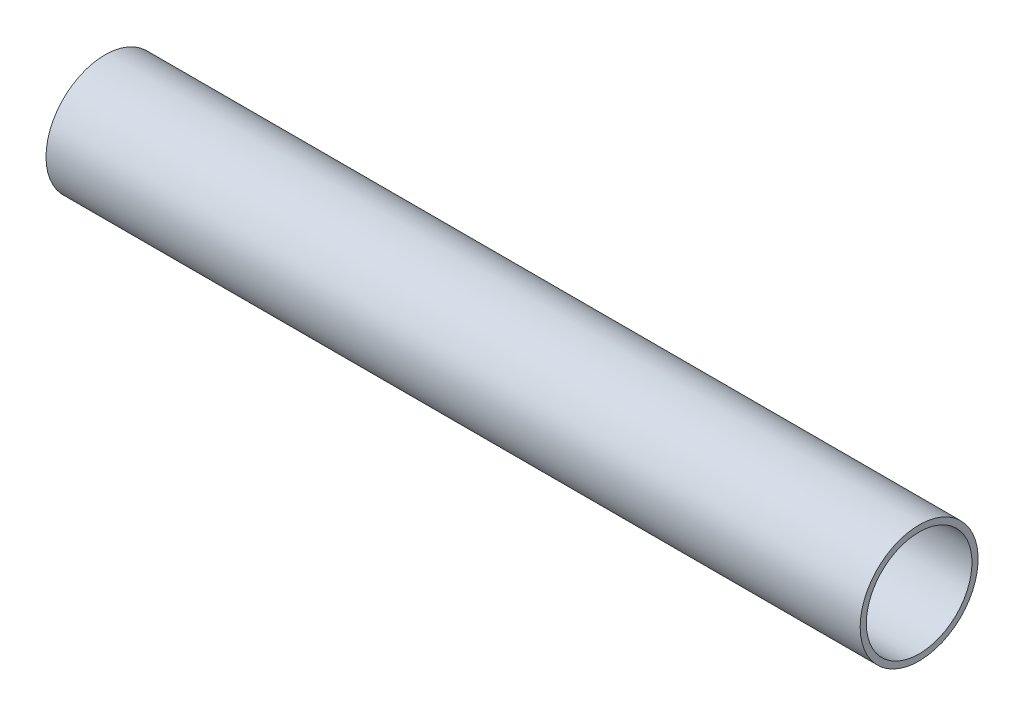
ISO-10303-21;
HEADER;
FILE_DESCRIPTION(('STEP AP214'),'2;1');
FILE_NAME('part.step','',(''),(''),'','','');
FILE_SCHEMA(('AUTOMOTIVE_DESIGN { 1 0 10303 214 1 1 1 1 }'));
ENDSEC;
DATA;
#1=APPLICATION_CONTEXT('core data for automotive mechanical design processes');
#2=APPLICATION_PROTOCOL_DEFINITION('international standard','automotive_design',2000,#1);
#3=PRODUCT_CONTEXT('',#1,'mechanical');
#4=PRODUCT('Part','Part','',(#3));
#5=PRODUCT_RELATED_PRODUCT_CATEGORY('part','',(#4));
#6=PRODUCT_DEFINITION_FORMATION('','',#4);
#7=PRODUCT_DEFINITION_CONTEXT('part definition',#1,'design');
#8=PRODUCT_DEFINITION('design','',#6,#7);
#9=PRODUCT_DEFINITION_SHAPE('','',#8);
#10=(LENGTH_UNIT() NAMED_UNIT(*) SI_UNIT(.MILLI.,.METRE.));
#11=(NAMED_UNIT(*) PLANE_ANGLE_UNIT() SI_UNIT($,.RADIAN.));
#12=(NAMED_UNIT(*) SI_UNIT($,.STERADIAN.) SOLID_ANGLE_UNIT());
#13=UNCERTAINTY_MEASURE_WITH_UNIT(LENGTH_MEASURE(1.E-05),#10,'distance_accuracy_value','');
#14=(GEOMETRIC_REPRESENTATION_CONTEXT(3) GLOBAL_UNCERTAINTY_ASSIGNED_CONTEXT((#13)) GLOBAL_UNIT_ASSIGNED_CONTEXT((#10,
#11,#12)) REPRESENTATION_CONTEXT('',''));
#15=CARTESIAN_POINT('',(0.,0.,0.));
#16=DIRECTION('',(0.,0.,1.));
#17=DIRECTION('',(1.,0.,0.));
#18=AXIS2_PLACEMENT_3D('',#15,#16,#17);
#19=CARTESIAN_POINT('',(1240.,0.,0.));
#20=DIRECTION('',(1.,0.,0.));
#21=DIRECTION('',(0.,0.,-1.));
#22=AXIS2_PLACEMENT_3D('',#19,#20,#21);
#23=PLANE('',#22);
#24=CARTESIAN_POINT('',(1240.,0.,0.));
#25=DIRECTION('',(-1.,0.,0.));
#26=DIRECTION('',(0.,0.,1.));
#27=AXIS2_PLACEMENT_3D('',#24,#25,#26);
#28=CIRCLE('',#27,13.4);
#29=CARTESIAN_POINT('',(1240.,0.,13.4));
#30=VERTEX_POINT('',#29);
#31=EDGE_CURVE('E10',#30,#30,#28,.T.);
#32=ORIENTED_EDGE('',*,*,#31,.T.);
#33=EDGE_LOOP('',(#32));
#34=FACE_BOUND('',#33,.T.);
#35=ADVANCED_FACE('F39',(#34),#23,.F.);
#36=CARTESIAN_POINT('',(-3000.,0.,0.));
#37=DIRECTION('',(-1.,0.,0.));
#38=DIRECTION('',(0.,0.,1.));
#39=AXIS2_PLACEMENT_3D('',#36,#37,#38);
#40=CYLINDRICAL_SURFACE('',#39,13.4);
#41=ORIENTED_EDGE('',*,*,#31,.F.);
#42=EDGE_LOOP('',(#41));
#43=FACE_BOUND('',#42,.T.);
#44=CARTESIAN_POINT('',(1425.,0.,0.));
#45=DIRECTION('',(-1.,0.,0.));
#46=DIRECTION('',(0.,0.,1.));
#47=AXIS2_PLACEMENT_3D('',#44,#45,#46);
#48=CIRCLE('',#47,13.4);
#49=CARTESIAN_POINT('',(1425.,0.,13.4));
#50=VERTEX_POINT('',#49);
#51=EDGE_CURVE('E44',#50,#50,#48,.T.);
#52=ORIENTED_EDGE('',*,*,#51,.T.);
#53=EDGE_LOOP('',(#52));
#54=FACE_BOUND('',#53,.T.);
#55=ADVANCED_FACE('F72',(#43,#54),#40,.T.);
#56=CARTESIAN_POINT('',(1425.,13.4,0.));
#57=DIRECTION('',(-1.,0.,0.));
#58=DIRECTION('',(0.,0.,1.));
#59=AXIS2_PLACEMENT_3D('',#56,#57,#58);
#60=PLANE('',#59);
#61=ORIENTED_EDGE('',*,*,#51,.F.);
#62=EDGE_LOOP('',(#61));
#63=FACE_BOUND('',#62,.T.);
#64=CARTESIAN_POINT('',(1425.,0.,0.));
#65=DIRECTION('',(-1.,0.,0.));
#66=DIRECTION('',(0.,0.,1.));
#67=AXIS2_PLACEMENT_3D('',#64,#65,#66);
#68=CIRCLE('',#67,12.);
#69=CARTESIAN_POINT('',(1425.,0.,12.));
#70=VERTEX_POINT('',#69);
#71=EDGE_CURVE('E47',#70,#70,#68,.T.);
#72=ORIENTED_EDGE('',*,*,#71,.T.);
#73=EDGE_LOOP('',(#72));
#74=FACE_BOUND('',#73,.T.);
#75=ADVANCED_FACE('F70',(#63,#74),#60,.F.);
#76=CARTESIAN_POINT('',(-3000.,0.,0.));
#77=DIRECTION('',(-1.,0.,0.));
#78=DIRECTION('',(0.,0.,1.));
#79=AXIS2_PLACEMENT_3D('',#76,#77,#78);
#80=CYLINDRICAL_SURFACE('',#79,12.);
#81=ORIENTED_EDGE('',*,*,#71,.F.);
#82=EDGE_LOOP('',(#81));
#83=FACE_BOUND('',#82,.T.);
#84=CARTESIAN_POINT('',(1242.,0.,0.));
#85=DIRECTION('',(-1.,0.,0.));
#86=DIRECTION('',(0.,0.,1.));
#87=AXIS2_PLACEMENT_3D('',#84,#85,#86);
#88=CIRCLE('',#87,12.);
#89=CARTESIAN_POINT('',(1242.,0.,12.));
#90=VERTEX_POINT('',#89);
#91=EDGE_CURVE('E52',#90,#90,#88,.T.);
#92=ORIENTED_EDGE('',*,*,#91,.T.);
#93=EDGE_LOOP('',(#92));
#94=FACE_BOUND('',#93,.T.);
#95=ADVANCED_FACE('F56',(#83,#94),#80,.F.);
#96=CARTESIAN_POINT('',(1242.,12.,0.));
#97=DIRECTION('',(-1.,0.,0.));
#98=DIRECTION('',(0.,0.,1.));
#99=AXIS2_PLACEMENT_3D('',#96,#97,#98);
#100=PLANE('',#99);
#101=ORIENTED_EDGE('',*,*,#91,.F.);
#102=EDGE_LOOP('',(#101));
#103=FACE_BOUND('',#102,.T.);
#104=ADVANCED_FACE('F62',(#103),#100,.F.);
#105=CLOSED_SHELL('',(#35,#55,#75,#95,#104));
#106=MANIFOLD_SOLID_BREP('B2',#105);
#107=ADVANCED_BREP_SHAPE_REPRESENTATION('',(#18,#106),#14);
#108=SHAPE_DEFINITION_REPRESENTATION(#9,#107);
ENDSEC;
END-ISO-10303-21;
